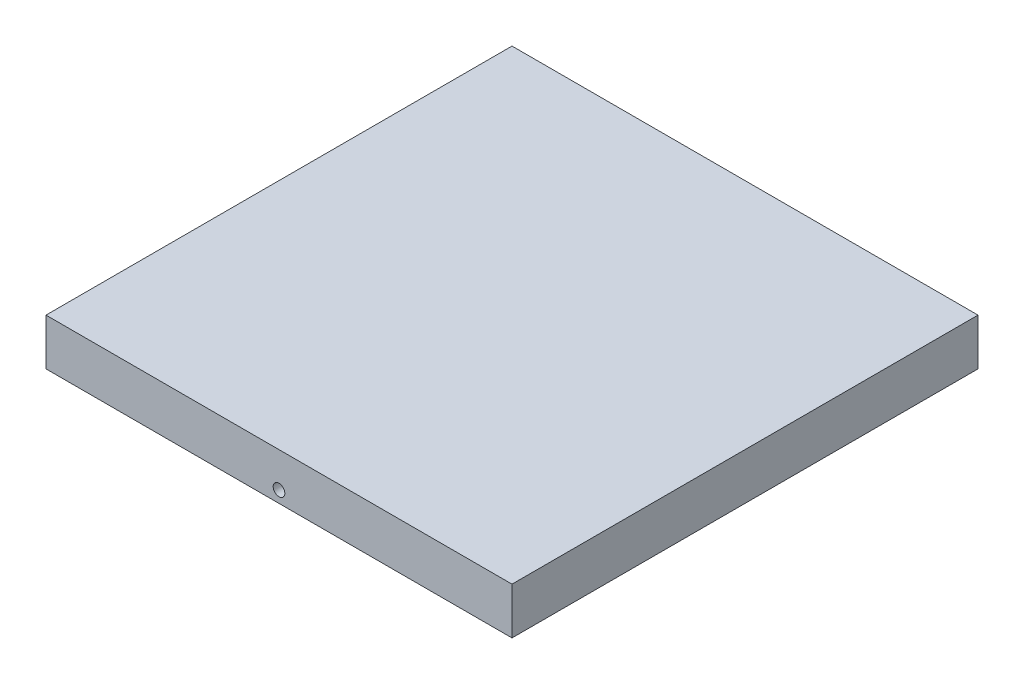
ISO-10303-21;
HEADER;
FILE_DESCRIPTION(('STEP AP214'),'2;1');
FILE_NAME('part.step','',(''),(''),'','','');
FILE_SCHEMA(('AUTOMOTIVE_DESIGN { 1 0 10303 214 1 1 1 1 }'));
ENDSEC;
DATA;
#1=APPLICATION_CONTEXT('core data for automotive mechanical design processes');
#2=APPLICATION_PROTOCOL_DEFINITION('international standard','automotive_design',2000,#1);
#3=PRODUCT_CONTEXT('',#1,'mechanical');
#4=PRODUCT('Part','Part','',(#3));
#5=PRODUCT_RELATED_PRODUCT_CATEGORY('part','',(#4));
#6=PRODUCT_DEFINITION_FORMATION('','',#4);
#7=PRODUCT_DEFINITION_CONTEXT('part definition',#1,'design');
#8=PRODUCT_DEFINITION('design','',#6,#7);
#9=PRODUCT_DEFINITION_SHAPE('','',#8);
#10=(LENGTH_UNIT() NAMED_UNIT(*) SI_UNIT(.MILLI.,.METRE.));
#11=(NAMED_UNIT(*) PLANE_ANGLE_UNIT() SI_UNIT($,.RADIAN.));
#12=(NAMED_UNIT(*) SI_UNIT($,.STERADIAN.) SOLID_ANGLE_UNIT());
#13=UNCERTAINTY_MEASURE_WITH_UNIT(LENGTH_MEASURE(1.E-05),#10,'distance_accuracy_value','');
#14=(GEOMETRIC_REPRESENTATION_CONTEXT(3) GLOBAL_UNCERTAINTY_ASSIGNED_CONTEXT((#13)) GLOBAL_UNIT_ASSIGNED_CONTEXT((#10,
#11,#12)) REPRESENTATION_CONTEXT('',''));
#15=CARTESIAN_POINT('',(0.,0.,0.));
#16=DIRECTION('',(0.,0.,1.));
#17=DIRECTION('',(1.,0.,0.));
#18=AXIS2_PLACEMENT_3D('',#15,#16,#17);
#19=CARTESIAN_POINT('',(31.75,6.35,-31.75));
#20=DIRECTION('',(-1.,0.,0.));
#21=DIRECTION('',(0.,0.,1.));
#22=AXIS2_PLACEMENT_3D('',#19,#20,#21);
#23=PLANE('',#22);
#24=DIRECTION('',(0.,0.,-1.));
#25=VECTOR('',#24,1.);
#26=CARTESIAN_POINT('',(31.75,0.,-31.75));
#27=LINE('',#26,#25);
#28=CARTESIAN_POINT('',(31.75,0.,31.75));
#29=VERTEX_POINT('',#28);
#30=CARTESIAN_POINT('',(31.75,0.,-31.75));
#31=VERTEX_POINT('',#30);
#32=EDGE_CURVE('E130',#29,#31,#27,.T.);
#33=ORIENTED_EDGE('',*,*,#32,.T.);
#34=DIRECTION('',(0.,-1.,0.));
#35=VECTOR('',#34,1.);
#36=CARTESIAN_POINT('',(31.75,6.35,-31.75));
#37=LINE('',#36,#35);
#38=CARTESIAN_POINT('',(31.75,6.35,-31.75));
#39=VERTEX_POINT('',#38);
#40=EDGE_CURVE('E11',#39,#31,#37,.T.);
#41=ORIENTED_EDGE('',*,*,#40,.F.);
#42=DIRECTION('',(0.,0.,-1.));
#43=VECTOR('',#42,1.);
#44=CARTESIAN_POINT('',(31.75,6.35,-31.75));
#45=LINE('',#44,#43);
#46=CARTESIAN_POINT('',(31.75,6.35,31.75));
#47=VERTEX_POINT('',#46);
#48=EDGE_CURVE('E154',#47,#39,#45,.T.);
#49=ORIENTED_EDGE('',*,*,#48,.F.);
#50=DIRECTION('',(0.,-1.,0.));
#51=VECTOR('',#50,1.);
#52=CARTESIAN_POINT('',(31.75,6.35,31.75));
#53=LINE('',#52,#51);
#54=EDGE_CURVE('E159',#47,#29,#53,.T.);
#55=ORIENTED_EDGE('',*,*,#54,.T.);
#56=EDGE_LOOP('',(#33,#41,#49,#55));
#57=FACE_BOUND('',#56,.T.);
#58=ADVANCED_FACE('F34',(#57),#23,.F.);
#59=CARTESIAN_POINT('',(-31.75,6.35,-31.75));
#60=DIRECTION('',(0.,0.,1.));
#61=DIRECTION('',(1.,0.,0.));
#62=AXIS2_PLACEMENT_3D('',#59,#60,#61);
#63=PLANE('',#62);
#64=DIRECTION('',(-1.,0.,0.));
#65=VECTOR('',#64,1.);
#66=CARTESIAN_POINT('',(-31.75,0.,-31.75));
#67=LINE('',#66,#65);
#68=CARTESIAN_POINT('',(-31.75,0.,-31.75));
#69=VERTEX_POINT('',#68);
#70=EDGE_CURVE('E134',#31,#69,#67,.T.);
#71=ORIENTED_EDGE('',*,*,#70,.T.);
#72=DIRECTION('',(0.,-1.,0.));
#73=VECTOR('',#72,1.);
#74=CARTESIAN_POINT('',(-31.75,6.35,-31.75));
#75=LINE('',#74,#73);
#76=CARTESIAN_POINT('',(-31.75,6.35,-31.75));
#77=VERTEX_POINT('',#76);
#78=EDGE_CURVE('E41',#77,#69,#75,.T.);
#79=ORIENTED_EDGE('',*,*,#78,.F.);
#80=DIRECTION('',(-1.,0.,0.));
#81=VECTOR('',#80,1.);
#82=CARTESIAN_POINT('',(-31.75,6.35,-31.75));
#83=LINE('',#82,#81);
#84=EDGE_CURVE('E85',#39,#77,#83,.T.);
#85=ORIENTED_EDGE('',*,*,#84,.F.);
#86=ORIENTED_EDGE('',*,*,#40,.T.);
#87=EDGE_LOOP('',(#71,#79,#85,#86));
#88=FACE_BOUND('',#87,.T.);
#89=ADVANCED_FACE('F191',(#88),#63,.F.);
#90=CARTESIAN_POINT('',(-31.75,6.35,-31.75));
#91=DIRECTION('',(1.,0.,0.));
#92=DIRECTION('',(0.,0.,-1.));
#93=AXIS2_PLACEMENT_3D('',#90,#91,#92);
#94=PLANE('',#93);
#95=DIRECTION('',(0.,0.,1.));
#96=VECTOR('',#95,1.);
#97=CARTESIAN_POINT('',(-31.75,0.,-31.75));
#98=LINE('',#97,#96);
#99=CARTESIAN_POINT('',(-31.75,0.,31.75));
#100=VERTEX_POINT('',#99);
#101=EDGE_CURVE('E162',#69,#100,#98,.T.);
#102=ORIENTED_EDGE('',*,*,#101,.T.);
#103=DIRECTION('',(0.,-1.,0.));
#104=VECTOR('',#103,1.);
#105=CARTESIAN_POINT('',(-31.75,6.35,31.75));
#106=LINE('',#105,#104);
#107=CARTESIAN_POINT('',(-31.75,6.35,31.75));
#108=VERTEX_POINT('',#107);
#109=EDGE_CURVE('E166',#108,#100,#106,.T.);
#110=ORIENTED_EDGE('',*,*,#109,.F.);
#111=DIRECTION('',(0.,0.,1.));
#112=VECTOR('',#111,1.);
#113=CARTESIAN_POINT('',(-31.75,6.35,-31.75));
#114=LINE('',#113,#112);
#115=EDGE_CURVE('E157',#77,#108,#114,.T.);
#116=ORIENTED_EDGE('',*,*,#115,.F.);
#117=ORIENTED_EDGE('',*,*,#78,.T.);
#118=EDGE_LOOP('',(#102,#110,#116,#117));
#119=FACE_BOUND('',#118,.T.);
#120=ADVANCED_FACE('F171',(#119),#94,.F.);
#121=CARTESIAN_POINT('',(-31.75,6.35,31.75));
#122=DIRECTION('',(0.,0.,-1.));
#123=DIRECTION('',(-1.,0.,0.));
#124=AXIS2_PLACEMENT_3D('',#121,#122,#123);
#125=PLANE('',#124);
#126=CARTESIAN_POINT('',(0.,1.5875,31.75));
#127=DIRECTION('',(0.,0.,-1.));
#128=DIRECTION('',(-1.,0.,0.));
#129=AXIS2_PLACEMENT_3D('',#126,#127,#128);
#130=CIRCLE('',#129,0.79375);
#131=CARTESIAN_POINT('',(-0.79375,1.5875,31.75));
#132=VERTEX_POINT('',#131);
#133=EDGE_CURVE('E149',#132,#132,#130,.T.);
#134=ORIENTED_EDGE('',*,*,#133,.T.);
#135=EDGE_LOOP('',(#134));
#136=FACE_BOUND('',#135,.T.);
#137=DIRECTION('',(1.,0.,0.));
#138=VECTOR('',#137,1.);
#139=CARTESIAN_POINT('',(-31.75,0.,31.75));
#140=LINE('',#139,#138);
#141=EDGE_CURVE('E78',#100,#29,#140,.T.);
#142=ORIENTED_EDGE('',*,*,#141,.T.);
#143=ORIENTED_EDGE('',*,*,#54,.F.);
#144=DIRECTION('',(1.,0.,0.));
#145=VECTOR('',#144,1.);
#146=CARTESIAN_POINT('',(-31.75,6.35,31.75));
#147=LINE('',#146,#145);
#148=EDGE_CURVE('E57',#108,#47,#147,.T.);
#149=ORIENTED_EDGE('',*,*,#148,.F.);
#150=ORIENTED_EDGE('',*,*,#109,.T.);
#151=EDGE_LOOP('',(#142,#143,#149,#150));
#152=FACE_BOUND('',#151,.T.);
#153=ADVANCED_FACE('F179',(#136,#152),#125,.F.);
#154=CARTESIAN_POINT('',(0.,6.35,0.));
#155=DIRECTION('',(0.,1.,0.));
#156=DIRECTION('',(0.,0.,1.));
#157=AXIS2_PLACEMENT_3D('',#154,#155,#156);
#158=PLANE('',#157);
#159=ORIENTED_EDGE('',*,*,#48,.T.);
#160=ORIENTED_EDGE('',*,*,#84,.T.);
#161=ORIENTED_EDGE('',*,*,#115,.T.);
#162=ORIENTED_EDGE('',*,*,#148,.T.);
#163=EDGE_LOOP('',(#159,#160,#161,#162));
#164=FACE_BOUND('',#163,.T.);
#165=ADVANCED_FACE('F181',(#164),#158,.T.);
#166=CARTESIAN_POINT('',(0.,0.,0.));
#167=DIRECTION('',(0.,1.,0.));
#168=DIRECTION('',(0.,0.,1.));
#169=AXIS2_PLACEMENT_3D('',#166,#167,#168);
#170=PLANE('',#169);
#171=DIRECTION('',(1.,0.,0.));
#172=VECTOR('',#171,1.);
#173=CARTESIAN_POINT('',(-31.75,0.,28.575));
#174=LINE('',#173,#172);
#175=CARTESIAN_POINT('',(-28.575,0.,28.575));
#176=VERTEX_POINT('',#175);
#177=CARTESIAN_POINT('',(28.575,0.,28.575));
#178=VERTEX_POINT('',#177);
#179=EDGE_CURVE('E125',#176,#178,#174,.T.);
#180=ORIENTED_EDGE('',*,*,#179,.T.);
#181=DIRECTION('',(0.,0.,-1.));
#182=VECTOR('',#181,1.);
#183=CARTESIAN_POINT('',(28.575,0.,-31.75));
#184=LINE('',#183,#182);
#185=CARTESIAN_POINT('',(28.575,0.,-28.575));
#186=VERTEX_POINT('',#185);
#187=EDGE_CURVE('E147',#178,#186,#184,.T.);
#188=ORIENTED_EDGE('',*,*,#187,.T.);
#189=DIRECTION('',(-1.,0.,0.));
#190=VECTOR('',#189,1.);
#191=CARTESIAN_POINT('',(-31.75,0.,-28.575));
#192=LINE('',#191,#190);
#193=CARTESIAN_POINT('',(-28.575,0.,-28.575));
#194=VERTEX_POINT('',#193);
#195=EDGE_CURVE('E129',#186,#194,#192,.T.);
#196=ORIENTED_EDGE('',*,*,#195,.T.);
#197=DIRECTION('',(0.,0.,1.));
#198=VECTOR('',#197,1.);
#199=CARTESIAN_POINT('',(-28.575,0.,-31.75));
#200=LINE('',#199,#198);
#201=EDGE_CURVE('E48',#194,#176,#200,.T.);
#202=ORIENTED_EDGE('',*,*,#201,.T.);
#203=EDGE_LOOP('',(#180,#188,#196,#202));
#204=FACE_BOUND('',#203,.T.);
#205=ORIENTED_EDGE('',*,*,#32,.F.);
#206=ORIENTED_EDGE('',*,*,#141,.F.);
#207=ORIENTED_EDGE('',*,*,#101,.F.);
#208=ORIENTED_EDGE('',*,*,#70,.F.);
#209=EDGE_LOOP('',(#205,#206,#207,#208));
#210=FACE_BOUND('',#209,.T.);
#211=ADVANCED_FACE('F175',(#204,#210),#170,.F.);
#212=CARTESIAN_POINT('',(28.575,6.35,-31.75));
#213=DIRECTION('',(-1.,0.,0.));
#214=DIRECTION('',(0.,0.,1.));
#215=AXIS2_PLACEMENT_3D('',#212,#213,#214);
#216=PLANE('',#215);
#217=ORIENTED_EDGE('',*,*,#187,.F.);
#218=DIRECTION('',(0.,-1.,0.));
#219=VECTOR('',#218,1.);
#220=CARTESIAN_POINT('',(28.575,6.35,28.575));
#221=LINE('',#220,#219);
#222=CARTESIAN_POINT('',(28.575,3.175,28.575));
#223=VERTEX_POINT('',#222);
#224=EDGE_CURVE('E124',#223,#178,#221,.T.);
#225=ORIENTED_EDGE('',*,*,#224,.F.);
#226=DIRECTION('',(0.,0.,-1.));
#227=VECTOR('',#226,1.);
#228=CARTESIAN_POINT('',(28.575,3.175,-31.75));
#229=LINE('',#228,#227);
#230=CARTESIAN_POINT('',(28.575,3.175,-28.575));
#231=VERTEX_POINT('',#230);
#232=EDGE_CURVE('E112',#223,#231,#229,.T.);
#233=ORIENTED_EDGE('',*,*,#232,.T.);
#234=DIRECTION('',(0.,-1.,0.));
#235=VECTOR('',#234,1.);
#236=CARTESIAN_POINT('',(28.575,6.35,-28.575));
#237=LINE('',#236,#235);
#238=EDGE_CURVE('E122',#231,#186,#237,.T.);
#239=ORIENTED_EDGE('',*,*,#238,.T.);
#240=EDGE_LOOP('',(#217,#225,#233,#239));
#241=FACE_BOUND('',#240,.T.);
#242=ADVANCED_FACE('F121',(#241),#216,.T.);
#243=CARTESIAN_POINT('',(-31.75,6.35,-28.575));
#244=DIRECTION('',(0.,0.,1.));
#245=DIRECTION('',(1.,0.,0.));
#246=AXIS2_PLACEMENT_3D('',#243,#244,#245);
#247=PLANE('',#246);
#248=ORIENTED_EDGE('',*,*,#195,.F.);
#249=ORIENTED_EDGE('',*,*,#238,.F.);
#250=DIRECTION('',(-1.,0.,0.));
#251=VECTOR('',#250,1.);
#252=CARTESIAN_POINT('',(-31.75,3.175,-28.575));
#253=LINE('',#252,#251);
#254=CARTESIAN_POINT('',(-28.575,3.175,-28.575));
#255=VERTEX_POINT('',#254);
#256=EDGE_CURVE('E108',#231,#255,#253,.T.);
#257=ORIENTED_EDGE('',*,*,#256,.T.);
#258=DIRECTION('',(0.,-1.,0.));
#259=VECTOR('',#258,1.);
#260=CARTESIAN_POINT('',(-28.575,6.35,-28.575));
#261=LINE('',#260,#259);
#262=EDGE_CURVE('E131',#255,#194,#261,.T.);
#263=ORIENTED_EDGE('',*,*,#262,.T.);
#264=EDGE_LOOP('',(#248,#249,#257,#263));
#265=FACE_BOUND('',#264,.T.);
#266=ADVANCED_FACE('F127',(#265),#247,.T.);
#267=CARTESIAN_POINT('',(-28.575,6.35,-31.75));
#268=DIRECTION('',(1.,0.,0.));
#269=DIRECTION('',(0.,0.,-1.));
#270=AXIS2_PLACEMENT_3D('',#267,#268,#269);
#271=PLANE('',#270);
#272=ORIENTED_EDGE('',*,*,#201,.F.);
#273=ORIENTED_EDGE('',*,*,#262,.F.);
#274=DIRECTION('',(0.,0.,1.));
#275=VECTOR('',#274,1.);
#276=CARTESIAN_POINT('',(-28.575,3.175,-31.75));
#277=LINE('',#276,#275);
#278=CARTESIAN_POINT('',(-28.575,3.175,28.575));
#279=VERTEX_POINT('',#278);
#280=EDGE_CURVE('E113',#255,#279,#277,.T.);
#281=ORIENTED_EDGE('',*,*,#280,.T.);
#282=DIRECTION('',(0.,-1.,0.));
#283=VECTOR('',#282,1.);
#284=CARTESIAN_POINT('',(-28.575,6.35,28.575));
#285=LINE('',#284,#283);
#286=EDGE_CURVE('E136',#279,#176,#285,.T.);
#287=ORIENTED_EDGE('',*,*,#286,.T.);
#288=EDGE_LOOP('',(#272,#273,#281,#287));
#289=FACE_BOUND('',#288,.T.);
#290=ADVANCED_FACE('F232',(#289),#271,.T.);
#291=CARTESIAN_POINT('',(-31.75,6.35,28.575));
#292=DIRECTION('',(0.,0.,-1.));
#293=DIRECTION('',(-1.,0.,0.));
#294=AXIS2_PLACEMENT_3D('',#291,#292,#293);
#295=PLANE('',#294);
#296=CARTESIAN_POINT('',(0.,1.5875,28.575));
#297=DIRECTION('',(0.,0.,-1.));
#298=DIRECTION('',(-1.,0.,0.));
#299=AXIS2_PLACEMENT_3D('',#296,#297,#298);
#300=CIRCLE('',#299,0.79375);
#301=CARTESIAN_POINT('',(-0.79375,1.5875,28.575));
#302=VERTEX_POINT('',#301);
#303=EDGE_CURVE('E139',#302,#302,#300,.T.);
#304=ORIENTED_EDGE('',*,*,#303,.F.);
#305=EDGE_LOOP('',(#304));
#306=FACE_BOUND('',#305,.T.);
#307=ORIENTED_EDGE('',*,*,#179,.F.);
#308=ORIENTED_EDGE('',*,*,#286,.F.);
#309=DIRECTION('',(1.,0.,0.));
#310=VECTOR('',#309,1.);
#311=CARTESIAN_POINT('',(-31.75,3.175,28.575));
#312=LINE('',#311,#310);
#313=EDGE_CURVE('E142',#279,#223,#312,.T.);
#314=ORIENTED_EDGE('',*,*,#313,.T.);
#315=ORIENTED_EDGE('',*,*,#224,.T.);
#316=EDGE_LOOP('',(#307,#308,#314,#315));
#317=FACE_BOUND('',#316,.T.);
#318=ADVANCED_FACE('F239',(#306,#317),#295,.T.);
#319=CARTESIAN_POINT('',(0.,3.175,0.));
#320=DIRECTION('',(0.,1.,0.));
#321=DIRECTION('',(0.,0.,1.));
#322=AXIS2_PLACEMENT_3D('',#319,#320,#321);
#323=PLANE('',#322);
#324=ORIENTED_EDGE('',*,*,#232,.F.);
#325=ORIENTED_EDGE('',*,*,#313,.F.);
#326=ORIENTED_EDGE('',*,*,#280,.F.);
#327=ORIENTED_EDGE('',*,*,#256,.F.);
#328=EDGE_LOOP('',(#324,#325,#326,#327));
#329=FACE_BOUND('',#328,.T.);
#330=ADVANCED_FACE('F110',(#329),#323,.F.);
#331=CARTESIAN_POINT('',(0.,1.5875,31.75));
#332=DIRECTION('',(0.,0.,-1.));
#333=DIRECTION('',(-1.,0.,0.));
#334=AXIS2_PLACEMENT_3D('',#331,#332,#333);
#335=CYLINDRICAL_SURFACE('',#334,0.79375);
#336=ORIENTED_EDGE('',*,*,#133,.F.);
#337=EDGE_LOOP('',(#336));
#338=FACE_BOUND('',#337,.T.);
#339=ORIENTED_EDGE('',*,*,#303,.T.);
#340=EDGE_LOOP('',(#339));
#341=FACE_BOUND('',#340,.T.);
#342=ADVANCED_FACE('F254',(#338,#341),#335,.F.);
#343=CLOSED_SHELL('',(#58,#89,#120,#153,#165,#211,#242,#266,#290,#318,#330,#342));
#344=MANIFOLD_SOLID_BREP('B2',#343);
#345=ADVANCED_BREP_SHAPE_REPRESENTATION('',(#18,#344),#14);
#346=SHAPE_DEFINITION_REPRESENTATION(#9,#345);
ENDSEC;
END-ISO-10303-21;
